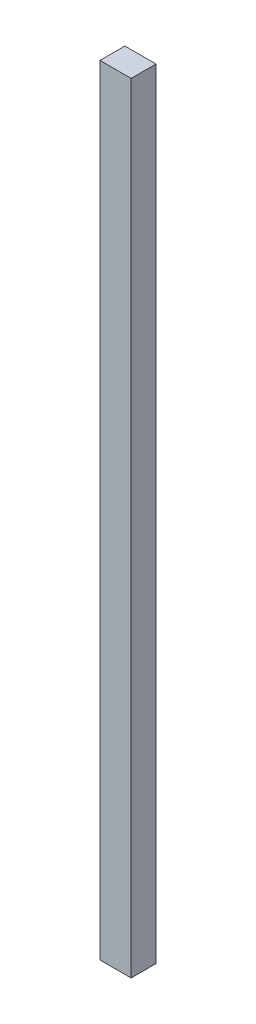
ISO-10303-21;
HEADER;
FILE_DESCRIPTION(('STEP AP214'),'2;1');
FILE_NAME('part.step','',(''),(''),'','','');
FILE_SCHEMA(('AUTOMOTIVE_DESIGN { 1 0 10303 214 1 1 1 1 }'));
ENDSEC;
DATA;
#1=APPLICATION_CONTEXT('core data for automotive mechanical design processes');
#2=APPLICATION_PROTOCOL_DEFINITION('international standard','automotive_design',2000,#1);
#3=PRODUCT_CONTEXT('',#1,'mechanical');
#4=PRODUCT('Part','Part','',(#3));
#5=PRODUCT_RELATED_PRODUCT_CATEGORY('part','',(#4));
#6=PRODUCT_DEFINITION_FORMATION('','',#4);
#7=PRODUCT_DEFINITION_CONTEXT('part definition',#1,'design');
#8=PRODUCT_DEFINITION('design','',#6,#7);
#9=PRODUCT_DEFINITION_SHAPE('','',#8);
#10=(LENGTH_UNIT() NAMED_UNIT(*) SI_UNIT(.MILLI.,.METRE.));
#11=(NAMED_UNIT(*) PLANE_ANGLE_UNIT() SI_UNIT($,.RADIAN.));
#12=(NAMED_UNIT(*) SI_UNIT($,.STERADIAN.) SOLID_ANGLE_UNIT());
#13=UNCERTAINTY_MEASURE_WITH_UNIT(LENGTH_MEASURE(1.E-05),#10,'distance_accuracy_value','');
#14=(GEOMETRIC_REPRESENTATION_CONTEXT(3) GLOBAL_UNCERTAINTY_ASSIGNED_CONTEXT((#13)) GLOBAL_UNIT_ASSIGNED_CONTEXT((#10,
#11,#12)) REPRESENTATION_CONTEXT('',''));
#15=CARTESIAN_POINT('',(0.,0.,0.));
#16=DIRECTION('',(0.,0.,1.));
#17=DIRECTION('',(1.,0.,0.));
#18=AXIS2_PLACEMENT_3D('',#15,#16,#17);
#19=CARTESIAN_POINT('',(1830.,-200.,40.));
#20=DIRECTION('',(0.,-1.,0.));
#21=DIRECTION('',(0.,0.,-1.));
#22=AXIS2_PLACEMENT_3D('',#19,#20,#21);
#23=PLANE('',#22);
#24=DIRECTION('',(-1.,0.,0.));
#25=VECTOR('',#24,1.);
#26=CARTESIAN_POINT('',(1830.,-200.,0.));
#27=LINE('',#26,#25);
#28=CARTESIAN_POINT('',(1830.,-200.,0.));
#29=VERTEX_POINT('',#28);
#30=CARTESIAN_POINT('',(1780.,-200.,0.));
#31=VERTEX_POINT('',#30);
#32=EDGE_CURVE('E105',#29,#31,#27,.T.);
#33=ORIENTED_EDGE('',*,*,#32,.T.);
#34=DIRECTION('',(0.,0.,-1.));
#35=VECTOR('',#34,1.);
#36=CARTESIAN_POINT('',(1780.,-200.,40.));
#37=LINE('',#36,#35);
#38=CARTESIAN_POINT('',(1780.,-200.,40.));
#39=VERTEX_POINT('',#38);
#40=EDGE_CURVE('E11',#39,#31,#37,.T.);
#41=ORIENTED_EDGE('',*,*,#40,.F.);
#42=DIRECTION('',(-1.,0.,0.));
#43=VECTOR('',#42,1.);
#44=CARTESIAN_POINT('',(1830.,-200.,40.));
#45=LINE('',#44,#43);
#46=CARTESIAN_POINT('',(1830.,-200.,40.));
#47=VERTEX_POINT('',#46);
#48=EDGE_CURVE('E89',#47,#39,#45,.T.);
#49=ORIENTED_EDGE('',*,*,#48,.F.);
#50=DIRECTION('',(0.,0.,-1.));
#51=VECTOR('',#50,1.);
#52=CARTESIAN_POINT('',(1830.,-200.,40.));
#53=LINE('',#52,#51);
#54=EDGE_CURVE('E97',#47,#29,#53,.T.);
#55=ORIENTED_EDGE('',*,*,#54,.T.);
#56=EDGE_LOOP('',(#33,#41,#49,#55));
#57=FACE_BOUND('',#56,.T.);
#58=ADVANCED_FACE('F39',(#57),#23,.F.);
#59=CARTESIAN_POINT('',(1780.,-200.,40.));
#60=DIRECTION('',(1.,0.,0.));
#61=DIRECTION('',(0.,0.,-1.));
#62=AXIS2_PLACEMENT_3D('',#59,#60,#61);
#63=PLANE('',#62);
#64=DIRECTION('',(0.,-1.,0.));
#65=VECTOR('',#64,1.);
#66=CARTESIAN_POINT('',(1780.,-200.,0.));
#67=LINE('',#66,#65);
#68=CARTESIAN_POINT('',(1780.,-1450.,0.));
#69=VERTEX_POINT('',#68);
#70=EDGE_CURVE('E92',#31,#69,#67,.T.);
#71=ORIENTED_EDGE('',*,*,#70,.T.);
#72=DIRECTION('',(0.,0.,-1.));
#73=VECTOR('',#72,1.);
#74=CARTESIAN_POINT('',(1780.,-1450.,40.));
#75=LINE('',#74,#73);
#76=CARTESIAN_POINT('',(1780.,-1450.,40.));
#77=VERTEX_POINT('',#76);
#78=EDGE_CURVE('E50',#77,#69,#75,.T.);
#79=ORIENTED_EDGE('',*,*,#78,.F.);
#80=DIRECTION('',(0.,-1.,0.));
#81=VECTOR('',#80,1.);
#82=CARTESIAN_POINT('',(1780.,-200.,40.));
#83=LINE('',#82,#81);
#84=EDGE_CURVE('E82',#39,#77,#83,.T.);
#85=ORIENTED_EDGE('',*,*,#84,.F.);
#86=ORIENTED_EDGE('',*,*,#40,.T.);
#87=EDGE_LOOP('',(#71,#79,#85,#86));
#88=FACE_BOUND('',#87,.T.);
#89=ADVANCED_FACE('F93',(#88),#63,.F.);
#90=CARTESIAN_POINT('',(1780.,-1450.,40.));
#91=DIRECTION('',(0.,1.,0.));
#92=DIRECTION('',(0.,0.,1.));
#93=AXIS2_PLACEMENT_3D('',#90,#91,#92);
#94=PLANE('',#93);
#95=DIRECTION('',(1.,0.,0.));
#96=VECTOR('',#95,1.);
#97=CARTESIAN_POINT('',(1780.,-1450.,0.));
#98=LINE('',#97,#96);
#99=CARTESIAN_POINT('',(1830.,-1450.,0.));
#100=VERTEX_POINT('',#99);
#101=EDGE_CURVE('E72',#69,#100,#98,.T.);
#102=ORIENTED_EDGE('',*,*,#101,.T.);
#103=DIRECTION('',(0.,0.,-1.));
#104=VECTOR('',#103,1.);
#105=CARTESIAN_POINT('',(1830.,-1450.,40.));
#106=LINE('',#105,#104);
#107=CARTESIAN_POINT('',(1830.,-1450.,40.));
#108=VERTEX_POINT('',#107);
#109=EDGE_CURVE('E94',#108,#100,#106,.T.);
#110=ORIENTED_EDGE('',*,*,#109,.F.);
#111=DIRECTION('',(1.,0.,0.));
#112=VECTOR('',#111,1.);
#113=CARTESIAN_POINT('',(1780.,-1450.,40.));
#114=LINE('',#113,#112);
#115=EDGE_CURVE('E88',#77,#108,#114,.T.);
#116=ORIENTED_EDGE('',*,*,#115,.F.);
#117=ORIENTED_EDGE('',*,*,#78,.T.);
#118=EDGE_LOOP('',(#102,#110,#116,#117));
#119=FACE_BOUND('',#118,.T.);
#120=ADVANCED_FACE('F96',(#119),#94,.F.);
#121=CARTESIAN_POINT('',(1830.,-1450.,40.));
#122=DIRECTION('',(-1.,0.,0.));
#123=DIRECTION('',(0.,0.,1.));
#124=AXIS2_PLACEMENT_3D('',#121,#122,#123);
#125=PLANE('',#124);
#126=DIRECTION('',(0.,1.,0.));
#127=VECTOR('',#126,1.);
#128=CARTESIAN_POINT('',(1830.,-1450.,0.));
#129=LINE('',#128,#127);
#130=EDGE_CURVE('E76',#100,#29,#129,.T.);
#131=ORIENTED_EDGE('',*,*,#130,.T.);
#132=ORIENTED_EDGE('',*,*,#54,.F.);
#133=DIRECTION('',(0.,1.,0.));
#134=VECTOR('',#133,1.);
#135=CARTESIAN_POINT('',(1830.,-1450.,40.));
#136=LINE('',#135,#134);
#137=EDGE_CURVE('E54',#108,#47,#136,.T.);
#138=ORIENTED_EDGE('',*,*,#137,.F.);
#139=ORIENTED_EDGE('',*,*,#109,.T.);
#140=EDGE_LOOP('',(#131,#132,#138,#139));
#141=FACE_BOUND('',#140,.T.);
#142=ADVANCED_FACE('F108',(#141),#125,.F.);
#143=CARTESIAN_POINT('',(0.,0.,40.));
#144=DIRECTION('',(0.,0.,1.));
#145=DIRECTION('',(1.,0.,0.));
#146=AXIS2_PLACEMENT_3D('',#143,#144,#145);
#147=PLANE('',#146);
#148=ORIENTED_EDGE('',*,*,#48,.T.);
#149=ORIENTED_EDGE('',*,*,#84,.T.);
#150=ORIENTED_EDGE('',*,*,#115,.T.);
#151=ORIENTED_EDGE('',*,*,#137,.T.);
#152=EDGE_LOOP('',(#148,#149,#150,#151));
#153=FACE_BOUND('',#152,.T.);
#154=ADVANCED_FACE('F86',(#153),#147,.T.);
#155=CARTESIAN_POINT('',(0.,0.,0.));
#156=DIRECTION('',(0.,0.,1.));
#157=DIRECTION('',(1.,0.,0.));
#158=AXIS2_PLACEMENT_3D('',#155,#156,#157);
#159=PLANE('',#158);
#160=ORIENTED_EDGE('',*,*,#32,.F.);
#161=ORIENTED_EDGE('',*,*,#130,.F.);
#162=ORIENTED_EDGE('',*,*,#101,.F.);
#163=ORIENTED_EDGE('',*,*,#70,.F.);
#164=EDGE_LOOP('',(#160,#161,#162,#163));
#165=FACE_BOUND('',#164,.T.);
#166=ADVANCED_FACE('F115',(#165),#159,.F.);
#167=CLOSED_SHELL('',(#58,#89,#120,#142,#154,#166));
#168=MANIFOLD_SOLID_BREP('B2',#167);
#169=ADVANCED_BREP_SHAPE_REPRESENTATION('',(#18,#168),#14);
#170=SHAPE_DEFINITION_REPRESENTATION(#9,#169);
ENDSEC;
END-ISO-10303-21;
